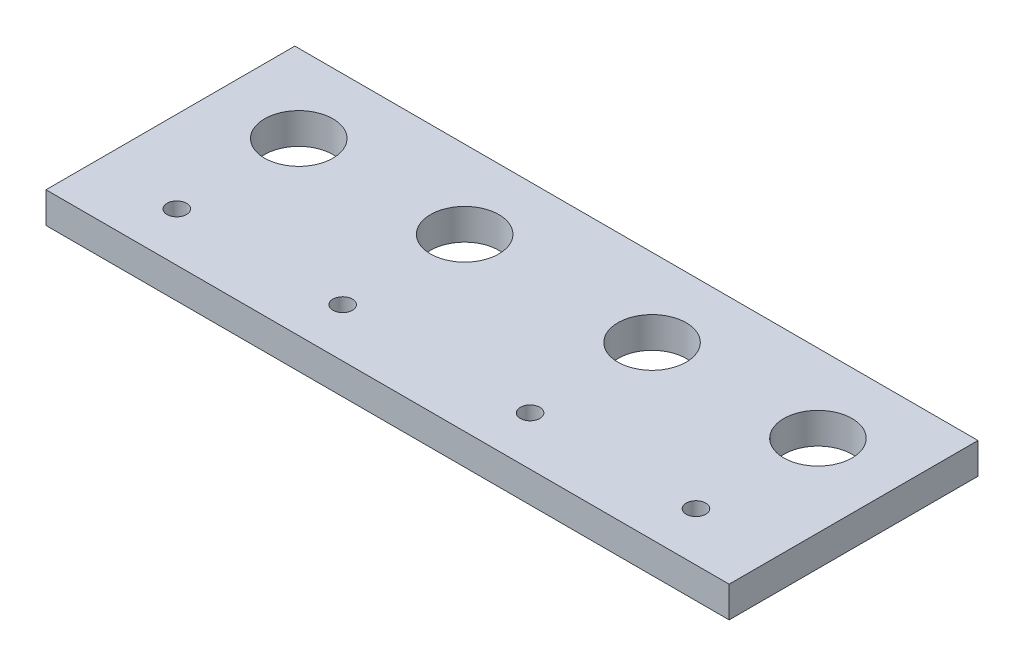
ISO-10303-21;
HEADER;
FILE_DESCRIPTION(('STEP AP214'),'2;1');
FILE_NAME('part.step','',(''),(''),'','','');
FILE_SCHEMA(('AUTOMOTIVE_DESIGN { 1 0 10303 214 1 1 1 1 }'));
ENDSEC;
DATA;
#1=APPLICATION_CONTEXT('core data for automotive mechanical design processes');
#2=APPLICATION_PROTOCOL_DEFINITION('international standard','automotive_design',2000,#1);
#3=PRODUCT_CONTEXT('',#1,'mechanical');
#4=PRODUCT('Part','Part','',(#3));
#5=PRODUCT_RELATED_PRODUCT_CATEGORY('part','',(#4));
#6=PRODUCT_DEFINITION_FORMATION('','',#4);
#7=PRODUCT_DEFINITION_CONTEXT('part definition',#1,'design');
#8=PRODUCT_DEFINITION('design','',#6,#7);
#9=PRODUCT_DEFINITION_SHAPE('','',#8);
#10=(LENGTH_UNIT() NAMED_UNIT(*) SI_UNIT(.MILLI.,.METRE.));
#11=(NAMED_UNIT(*) PLANE_ANGLE_UNIT() SI_UNIT($,.RADIAN.));
#12=(NAMED_UNIT(*) SI_UNIT($,.STERADIAN.) SOLID_ANGLE_UNIT());
#13=UNCERTAINTY_MEASURE_WITH_UNIT(LENGTH_MEASURE(1.E-05),#10,'distance_accuracy_value','');
#14=(GEOMETRIC_REPRESENTATION_CONTEXT(3) GLOBAL_UNCERTAINTY_ASSIGNED_CONTEXT((#13)) GLOBAL_UNIT_ASSIGNED_CONTEXT((#10,
#11,#12)) REPRESENTATION_CONTEXT('',''));
#15=CARTESIAN_POINT('',(0.,0.,0.));
#16=DIRECTION('',(0.,0.,1.));
#17=DIRECTION('',(1.,0.,0.));
#18=AXIS2_PLACEMENT_3D('',#15,#16,#17);
#19=CARTESIAN_POINT('',(0.,6.35,51.));
#20=DIRECTION('',(0.,0.,1.));
#21=DIRECTION('',(1.,0.,0.));
#22=AXIS2_PLACEMENT_3D('',#19,#20,#21);
#23=PLANE('',#22);
#24=DIRECTION('',(-1.,0.,0.));
#25=VECTOR('',#24,1.);
#26=CARTESIAN_POINT('',(0.,0.,51.));
#27=LINE('',#26,#25);
#28=CARTESIAN_POINT('',(70.,0.,51.));
#29=VERTEX_POINT('',#28);
#30=CARTESIAN_POINT('',(-70.,0.,51.));
#31=VERTEX_POINT('',#30);
#32=EDGE_CURVE('E124',#29,#31,#27,.T.);
#33=ORIENTED_EDGE('',*,*,#32,.F.);
#34=DIRECTION('',(0.,-1.,0.));
#35=VECTOR('',#34,1.);
#36=CARTESIAN_POINT('',(70.,6.35,51.));
#37=LINE('',#36,#35);
#38=CARTESIAN_POINT('',(70.,6.35,51.));
#39=VERTEX_POINT('',#38);
#40=EDGE_CURVE('E11',#39,#29,#37,.T.);
#41=ORIENTED_EDGE('',*,*,#40,.F.);
#42=DIRECTION('',(-1.,0.,0.));
#43=VECTOR('',#42,1.);
#44=CARTESIAN_POINT('',(0.,6.35,51.));
#45=LINE('',#44,#43);
#46=CARTESIAN_POINT('',(-70.,6.35,51.));
#47=VERTEX_POINT('',#46);
#48=EDGE_CURVE('E93',#39,#47,#45,.T.);
#49=ORIENTED_EDGE('',*,*,#48,.T.);
#50=DIRECTION('',(0.,-1.,0.));
#51=VECTOR('',#50,1.);
#52=CARTESIAN_POINT('',(-70.,6.35,51.));
#53=LINE('',#52,#51);
#54=EDGE_CURVE('E74',#47,#31,#53,.T.);
#55=ORIENTED_EDGE('',*,*,#54,.T.);
#56=EDGE_LOOP('',(#33,#41,#49,#55));
#57=FACE_BOUND('',#56,.T.);
#58=ADVANCED_FACE('F35',(#57),#23,.T.);
#59=CARTESIAN_POINT('',(70.,6.35,0.));
#60=DIRECTION('',(1.,0.,0.));
#61=DIRECTION('',(0.,0.,-1.));
#62=AXIS2_PLACEMENT_3D('',#59,#60,#61);
#63=PLANE('',#62);
#64=DIRECTION('',(0.,0.,1.));
#65=VECTOR('',#64,1.);
#66=CARTESIAN_POINT('',(70.,0.,0.));
#67=LINE('',#66,#65);
#68=CARTESIAN_POINT('',(70.,0.,0.));
#69=VERTEX_POINT('',#68);
#70=EDGE_CURVE('E85',#69,#29,#67,.T.);
#71=ORIENTED_EDGE('',*,*,#70,.F.);
#72=DIRECTION('',(0.,-1.,0.));
#73=VECTOR('',#72,1.);
#74=CARTESIAN_POINT('',(70.,6.35,0.));
#75=LINE('',#74,#73);
#76=CARTESIAN_POINT('',(70.,6.35,0.));
#77=VERTEX_POINT('',#76);
#78=EDGE_CURVE('E44',#77,#69,#75,.T.);
#79=ORIENTED_EDGE('',*,*,#78,.F.);
#80=DIRECTION('',(0.,0.,1.));
#81=VECTOR('',#80,1.);
#82=CARTESIAN_POINT('',(70.,6.35,0.));
#83=LINE('',#82,#81);
#84=EDGE_CURVE('E83',#77,#39,#83,.T.);
#85=ORIENTED_EDGE('',*,*,#84,.T.);
#86=ORIENTED_EDGE('',*,*,#40,.T.);
#87=EDGE_LOOP('',(#71,#79,#85,#86));
#88=FACE_BOUND('',#87,.T.);
#89=ADVANCED_FACE('F82',(#88),#63,.T.);
#90=CARTESIAN_POINT('',(0.,6.35,0.));
#91=DIRECTION('',(0.,0.,-1.));
#92=DIRECTION('',(-1.,0.,0.));
#93=AXIS2_PLACEMENT_3D('',#90,#91,#92);
#94=PLANE('',#93);
#95=DIRECTION('',(1.,0.,0.));
#96=VECTOR('',#95,1.);
#97=CARTESIAN_POINT('',(0.,0.,0.));
#98=LINE('',#97,#96);
#99=CARTESIAN_POINT('',(-70.,0.,0.));
#100=VERTEX_POINT('',#99);
#101=EDGE_CURVE('E128',#100,#69,#98,.T.);
#102=ORIENTED_EDGE('',*,*,#101,.F.);
#103=DIRECTION('',(0.,-1.,0.));
#104=VECTOR('',#103,1.);
#105=CARTESIAN_POINT('',(-70.,6.35,0.));
#106=LINE('',#105,#104);
#107=CARTESIAN_POINT('',(-70.,6.35,0.));
#108=VERTEX_POINT('',#107);
#109=EDGE_CURVE('E67',#108,#100,#106,.T.);
#110=ORIENTED_EDGE('',*,*,#109,.F.);
#111=DIRECTION('',(1.,0.,0.));
#112=VECTOR('',#111,1.);
#113=CARTESIAN_POINT('',(0.,6.35,0.));
#114=LINE('',#113,#112);
#115=EDGE_CURVE('E92',#108,#77,#114,.T.);
#116=ORIENTED_EDGE('',*,*,#115,.T.);
#117=ORIENTED_EDGE('',*,*,#78,.T.);
#118=EDGE_LOOP('',(#102,#110,#116,#117));
#119=FACE_BOUND('',#118,.T.);
#120=ADVANCED_FACE('F95',(#119),#94,.T.);
#121=CARTESIAN_POINT('',(-19.2,6.35,16.));
#122=DIRECTION('',(0.,-1.,0.));
#123=DIRECTION('',(0.,0.,-1.));
#124=AXIS2_PLACEMENT_3D('',#121,#122,#123);
#125=CYLINDRICAL_SURFACE('',#124,7.00000000000001);
#126=CARTESIAN_POINT('',(-19.2,6.35,16.));
#127=DIRECTION('',(0.,1.,0.));
#128=DIRECTION('',(0.,0.,1.));
#129=AXIS2_PLACEMENT_3D('',#126,#127,#128);
#130=CIRCLE('',#129,7.00000000000001);
#131=CARTESIAN_POINT('',(-19.2,6.35,23.));
#132=VERTEX_POINT('',#131);
#133=EDGE_CURVE('E115',#132,#132,#130,.F.);
#134=ORIENTED_EDGE('',*,*,#133,.F.);
#135=EDGE_LOOP('',(#134));
#136=FACE_BOUND('',#135,.T.);
#137=CARTESIAN_POINT('',(-19.2,0.,16.));
#138=DIRECTION('',(0.,1.,0.));
#139=DIRECTION('',(0.,0.,1.));
#140=AXIS2_PLACEMENT_3D('',#137,#138,#139);
#141=CIRCLE('',#140,7.00000000000001);
#142=CARTESIAN_POINT('',(-19.2,0.,23.));
#143=VERTEX_POINT('',#142);
#144=EDGE_CURVE('E147',#143,#143,#141,.F.);
#145=ORIENTED_EDGE('',*,*,#144,.T.);
#146=EDGE_LOOP('',(#145));
#147=FACE_BOUND('',#146,.T.);
#148=ADVANCED_FACE('F169',(#136,#147),#125,.F.);
#149=CARTESIAN_POINT('',(53.2,6.35,16.));
#150=DIRECTION('',(0.,-1.,0.));
#151=DIRECTION('',(0.,0.,-1.));
#152=AXIS2_PLACEMENT_3D('',#149,#150,#151);
#153=CYLINDRICAL_SURFACE('',#152,6.99999999999999);
#154=CARTESIAN_POINT('',(53.2,6.35,16.));
#155=DIRECTION('',(0.,1.,0.));
#156=DIRECTION('',(0.,0.,1.));
#157=AXIS2_PLACEMENT_3D('',#154,#155,#156);
#158=CIRCLE('',#157,6.99999999999999);
#159=CARTESIAN_POINT('',(53.2,6.35,23.));
#160=VERTEX_POINT('',#159);
#161=EDGE_CURVE('E112',#160,#160,#158,.T.);
#162=ORIENTED_EDGE('',*,*,#161,.T.);
#163=EDGE_LOOP('',(#162));
#164=FACE_BOUND('',#163,.T.);
#165=CARTESIAN_POINT('',(53.2,0.,16.));
#166=DIRECTION('',(0.,1.,0.));
#167=DIRECTION('',(0.,0.,1.));
#168=AXIS2_PLACEMENT_3D('',#165,#166,#167);
#169=CIRCLE('',#168,6.99999999999999);
#170=CARTESIAN_POINT('',(53.2,0.,23.));
#171=VERTEX_POINT('',#170);
#172=EDGE_CURVE('E144',#171,#171,#169,.T.);
#173=ORIENTED_EDGE('',*,*,#172,.F.);
#174=EDGE_LOOP('',(#173));
#175=FACE_BOUND('',#174,.T.);
#176=ADVANCED_FACE('F188',(#164,#175),#153,.F.);
#177=CARTESIAN_POINT('',(19.2,6.35,16.));
#178=DIRECTION('',(0.,-1.,0.));
#179=DIRECTION('',(0.,0.,-1.));
#180=AXIS2_PLACEMENT_3D('',#177,#178,#179);
#181=CYLINDRICAL_SURFACE('',#180,7.);
#182=CARTESIAN_POINT('',(19.2,6.35,16.));
#183=DIRECTION('',(0.,1.,0.));
#184=DIRECTION('',(0.,0.,1.));
#185=AXIS2_PLACEMENT_3D('',#182,#183,#184);
#186=CIRCLE('',#185,7.);
#187=CARTESIAN_POINT('',(19.2,6.35,23.));
#188=VERTEX_POINT('',#187);
#189=EDGE_CURVE('E109',#188,#188,#186,.T.);
#190=ORIENTED_EDGE('',*,*,#189,.T.);
#191=EDGE_LOOP('',(#190));
#192=FACE_BOUND('',#191,.T.);
#193=CARTESIAN_POINT('',(19.2,0.,16.));
#194=DIRECTION('',(0.,1.,0.));
#195=DIRECTION('',(0.,0.,1.));
#196=AXIS2_PLACEMENT_3D('',#193,#194,#195);
#197=CIRCLE('',#196,7.);
#198=CARTESIAN_POINT('',(19.2,0.,23.));
#199=VERTEX_POINT('',#198);
#200=EDGE_CURVE('E141',#199,#199,#197,.T.);
#201=ORIENTED_EDGE('',*,*,#200,.F.);
#202=EDGE_LOOP('',(#201));
#203=FACE_BOUND('',#202,.T.);
#204=ADVANCED_FACE('F184',(#192,#203),#181,.F.);
#205=CARTESIAN_POINT('',(-53.2,6.35,41.));
#206=DIRECTION('',(0.,-1.,0.));
#207=DIRECTION('',(0.,0.,-1.));
#208=AXIS2_PLACEMENT_3D('',#205,#206,#207);
#209=CYLINDRICAL_SURFACE('',#208,2.);
#210=CARTESIAN_POINT('',(-53.2,6.35,41.));
#211=DIRECTION('',(0.,1.,0.));
#212=DIRECTION('',(0.,0.,1.));
#213=AXIS2_PLACEMENT_3D('',#210,#211,#212);
#214=CIRCLE('',#213,2.);
#215=CARTESIAN_POINT('',(-53.2,6.35,43.));
#216=VERTEX_POINT('',#215);
#217=EDGE_CURVE('E106',#216,#216,#214,.T.);
#218=ORIENTED_EDGE('',*,*,#217,.T.);
#219=EDGE_LOOP('',(#218));
#220=FACE_BOUND('',#219,.T.);
#221=CARTESIAN_POINT('',(-53.2,0.,41.));
#222=DIRECTION('',(0.,1.,0.));
#223=DIRECTION('',(0.,0.,1.));
#224=AXIS2_PLACEMENT_3D('',#221,#222,#223);
#225=CIRCLE('',#224,2.);
#226=CARTESIAN_POINT('',(-53.2,0.,43.));
#227=VERTEX_POINT('',#226);
#228=EDGE_CURVE('E138',#227,#227,#225,.T.);
#229=ORIENTED_EDGE('',*,*,#228,.F.);
#230=EDGE_LOOP('',(#229));
#231=FACE_BOUND('',#230,.T.);
#232=ADVANCED_FACE('F180',(#220,#231),#209,.F.);
#233=CARTESIAN_POINT('',(19.2,6.35,41.));
#234=DIRECTION('',(0.,-1.,0.));
#235=DIRECTION('',(0.,0.,-1.));
#236=AXIS2_PLACEMENT_3D('',#233,#234,#235);
#237=CYLINDRICAL_SURFACE('',#236,2.);
#238=CARTESIAN_POINT('',(19.2,6.35,41.));
#239=DIRECTION('',(0.,1.,0.));
#240=DIRECTION('',(0.,0.,1.));
#241=AXIS2_PLACEMENT_3D('',#238,#239,#240);
#242=CIRCLE('',#241,2.);
#243=CARTESIAN_POINT('',(19.2,6.35,43.));
#244=VERTEX_POINT('',#243);
#245=EDGE_CURVE('E103',#244,#244,#242,.F.);
#246=ORIENTED_EDGE('',*,*,#245,.F.);
#247=EDGE_LOOP('',(#246));
#248=FACE_BOUND('',#247,.T.);
#249=CARTESIAN_POINT('',(19.2,0.,41.));
#250=DIRECTION('',(0.,1.,0.));
#251=DIRECTION('',(0.,0.,1.));
#252=AXIS2_PLACEMENT_3D('',#249,#250,#251);
#253=CIRCLE('',#252,2.);
#254=CARTESIAN_POINT('',(19.2,0.,43.));
#255=VERTEX_POINT('',#254);
#256=EDGE_CURVE('E135',#255,#255,#253,.F.);
#257=ORIENTED_EDGE('',*,*,#256,.T.);
#258=EDGE_LOOP('',(#257));
#259=FACE_BOUND('',#258,.T.);
#260=ADVANCED_FACE('F176',(#248,#259),#237,.F.);
#261=CARTESIAN_POINT('',(-19.2,6.35,41.));
#262=DIRECTION('',(0.,-1.,0.));
#263=DIRECTION('',(0.,0.,-1.));
#264=AXIS2_PLACEMENT_3D('',#261,#262,#263);
#265=CYLINDRICAL_SURFACE('',#264,2.);
#266=CARTESIAN_POINT('',(-19.2,6.35,41.));
#267=DIRECTION('',(0.,1.,0.));
#268=DIRECTION('',(0.,0.,1.));
#269=AXIS2_PLACEMENT_3D('',#266,#267,#268);
#270=CIRCLE('',#269,2.);
#271=CARTESIAN_POINT('',(-19.2,6.35,43.));
#272=VERTEX_POINT('',#271);
#273=EDGE_CURVE('E97',#272,#272,#270,.T.);
#274=ORIENTED_EDGE('',*,*,#273,.T.);
#275=EDGE_LOOP('',(#274));
#276=FACE_BOUND('',#275,.T.);
#277=CARTESIAN_POINT('',(-19.2,0.,41.));
#278=DIRECTION('',(0.,1.,0.));
#279=DIRECTION('',(0.,0.,1.));
#280=AXIS2_PLACEMENT_3D('',#277,#278,#279);
#281=CIRCLE('',#280,2.);
#282=CARTESIAN_POINT('',(-19.2,0.,43.));
#283=VERTEX_POINT('',#282);
#284=EDGE_CURVE('E132',#283,#283,#281,.T.);
#285=ORIENTED_EDGE('',*,*,#284,.F.);
#286=EDGE_LOOP('',(#285));
#287=FACE_BOUND('',#286,.T.);
#288=ADVANCED_FACE('F173',(#276,#287),#265,.F.);
#289=CARTESIAN_POINT('',(-70.,6.35,0.));
#290=DIRECTION('',(1.,0.,0.));
#291=DIRECTION('',(0.,0.,-1.));
#292=AXIS2_PLACEMENT_3D('',#289,#290,#291);
#293=PLANE('',#292);
#294=DIRECTION('',(0.,0.,1.));
#295=VECTOR('',#294,1.);
#296=CARTESIAN_POINT('',(-70.,0.,0.));
#297=LINE('',#296,#295);
#298=EDGE_CURVE('E130',#100,#31,#297,.T.);
#299=ORIENTED_EDGE('',*,*,#298,.T.);
#300=ORIENTED_EDGE('',*,*,#54,.F.);
#301=DIRECTION('',(0.,0.,1.));
#302=VECTOR('',#301,1.);
#303=CARTESIAN_POINT('',(-70.,6.35,0.));
#304=LINE('',#303,#302);
#305=EDGE_CURVE('E52',#108,#47,#304,.T.);
#306=ORIENTED_EDGE('',*,*,#305,.F.);
#307=ORIENTED_EDGE('',*,*,#109,.T.);
#308=EDGE_LOOP('',(#299,#300,#306,#307));
#309=FACE_BOUND('',#308,.T.);
#310=ADVANCED_FACE('F170',(#309),#293,.F.);
#311=CARTESIAN_POINT('',(53.2,6.35,41.));
#312=DIRECTION('',(0.,-1.,0.));
#313=DIRECTION('',(0.,0.,-1.));
#314=AXIS2_PLACEMENT_3D('',#311,#312,#313);
#315=CYLINDRICAL_SURFACE('',#314,1.99999999999999);
#316=CARTESIAN_POINT('',(53.2,6.35,41.));
#317=DIRECTION('',(0.,1.,0.));
#318=DIRECTION('',(0.,0.,1.));
#319=AXIS2_PLACEMENT_3D('',#316,#317,#318);
#320=CIRCLE('',#319,1.99999999999999);
#321=CARTESIAN_POINT('',(53.2,6.35,43.));
#322=VERTEX_POINT('',#321);
#323=EDGE_CURVE('E153',#322,#322,#320,.F.);
#324=ORIENTED_EDGE('',*,*,#323,.F.);
#325=EDGE_LOOP('',(#324));
#326=FACE_BOUND('',#325,.T.);
#327=CARTESIAN_POINT('',(53.2,0.,41.));
#328=DIRECTION('',(0.,1.,0.));
#329=DIRECTION('',(0.,0.,1.));
#330=AXIS2_PLACEMENT_3D('',#327,#328,#329);
#331=CIRCLE('',#330,1.99999999999999);
#332=CARTESIAN_POINT('',(53.2,0.,43.));
#333=VERTEX_POINT('',#332);
#334=EDGE_CURVE('E121',#333,#333,#331,.F.);
#335=ORIENTED_EDGE('',*,*,#334,.T.);
#336=EDGE_LOOP('',(#335));
#337=FACE_BOUND('',#336,.T.);
#338=ADVANCED_FACE('F37',(#326,#337),#315,.F.);
#339=CARTESIAN_POINT('',(-53.2,6.35,16.));
#340=DIRECTION('',(0.,-1.,0.));
#341=DIRECTION('',(0.,0.,-1.));
#342=AXIS2_PLACEMENT_3D('',#339,#340,#341);
#343=CYLINDRICAL_SURFACE('',#342,6.99999999999999);
#344=CARTESIAN_POINT('',(-53.2,6.35,16.));
#345=DIRECTION('',(0.,1.,0.));
#346=DIRECTION('',(0.,0.,1.));
#347=AXIS2_PLACEMENT_3D('',#344,#345,#346);
#348=CIRCLE('',#347,6.99999999999999);
#349=CARTESIAN_POINT('',(-53.2,6.35,23.));
#350=VERTEX_POINT('',#349);
#351=EDGE_CURVE('E118',#350,#350,#348,.F.);
#352=ORIENTED_EDGE('',*,*,#351,.F.);
#353=EDGE_LOOP('',(#352));
#354=FACE_BOUND('',#353,.T.);
#355=CARTESIAN_POINT('',(-53.2,0.,16.));
#356=DIRECTION('',(0.,1.,0.));
#357=DIRECTION('',(0.,0.,1.));
#358=AXIS2_PLACEMENT_3D('',#355,#356,#357);
#359=CIRCLE('',#358,6.99999999999999);
#360=CARTESIAN_POINT('',(-53.2,0.,23.));
#361=VERTEX_POINT('',#360);
#362=EDGE_CURVE('E150',#361,#361,#359,.F.);
#363=ORIENTED_EDGE('',*,*,#362,.T.);
#364=EDGE_LOOP('',(#363));
#365=FACE_BOUND('',#364,.T.);
#366=ADVANCED_FACE('F196',(#354,#365),#343,.F.);
#367=CARTESIAN_POINT('',(0.,6.35,0.));
#368=DIRECTION('',(0.,1.,0.));
#369=DIRECTION('',(0.,0.,1.));
#370=AXIS2_PLACEMENT_3D('',#367,#368,#369);
#371=PLANE('',#370);
#372=ORIENTED_EDGE('',*,*,#323,.T.);
#373=EDGE_LOOP('',(#372));
#374=FACE_BOUND('',#373,.T.);
#375=ORIENTED_EDGE('',*,*,#48,.F.);
#376=ORIENTED_EDGE('',*,*,#84,.F.);
#377=ORIENTED_EDGE('',*,*,#115,.F.);
#378=ORIENTED_EDGE('',*,*,#305,.T.);
#379=EDGE_LOOP('',(#375,#376,#377,#378));
#380=FACE_BOUND('',#379,.T.);
#381=ORIENTED_EDGE('',*,*,#273,.F.);
#382=EDGE_LOOP('',(#381));
#383=FACE_BOUND('',#382,.T.);
#384=ORIENTED_EDGE('',*,*,#245,.T.);
#385=EDGE_LOOP('',(#384));
#386=FACE_BOUND('',#385,.T.);
#387=ORIENTED_EDGE('',*,*,#217,.F.);
#388=EDGE_LOOP('',(#387));
#389=FACE_BOUND('',#388,.T.);
#390=ORIENTED_EDGE('',*,*,#189,.F.);
#391=EDGE_LOOP('',(#390));
#392=FACE_BOUND('',#391,.T.);
#393=ORIENTED_EDGE('',*,*,#161,.F.);
#394=EDGE_LOOP('',(#393));
#395=FACE_BOUND('',#394,.T.);
#396=ORIENTED_EDGE('',*,*,#133,.T.);
#397=EDGE_LOOP('',(#396));
#398=FACE_BOUND('',#397,.T.);
#399=ORIENTED_EDGE('',*,*,#351,.T.);
#400=EDGE_LOOP('',(#399));
#401=FACE_BOUND('',#400,.T.);
#402=ADVANCED_FACE('F90',(#374,#380,#383,#386,#389,#392,#395,#398,#401),#371,.T.);
#403=CARTESIAN_POINT('',(0.,0.,0.));
#404=DIRECTION('',(0.,1.,0.));
#405=DIRECTION('',(0.,0.,1.));
#406=AXIS2_PLACEMENT_3D('',#403,#404,#405);
#407=PLANE('',#406);
#408=ORIENTED_EDGE('',*,*,#334,.F.);
#409=EDGE_LOOP('',(#408));
#410=FACE_BOUND('',#409,.T.);
#411=ORIENTED_EDGE('',*,*,#32,.T.);
#412=ORIENTED_EDGE('',*,*,#298,.F.);
#413=ORIENTED_EDGE('',*,*,#101,.T.);
#414=ORIENTED_EDGE('',*,*,#70,.T.);
#415=EDGE_LOOP('',(#411,#412,#413,#414));
#416=FACE_BOUND('',#415,.T.);
#417=ORIENTED_EDGE('',*,*,#284,.T.);
#418=EDGE_LOOP('',(#417));
#419=FACE_BOUND('',#418,.T.);
#420=ORIENTED_EDGE('',*,*,#256,.F.);
#421=EDGE_LOOP('',(#420));
#422=FACE_BOUND('',#421,.T.);
#423=ORIENTED_EDGE('',*,*,#228,.T.);
#424=EDGE_LOOP('',(#423));
#425=FACE_BOUND('',#424,.T.);
#426=ORIENTED_EDGE('',*,*,#200,.T.);
#427=EDGE_LOOP('',(#426));
#428=FACE_BOUND('',#427,.T.);
#429=ORIENTED_EDGE('',*,*,#172,.T.);
#430=EDGE_LOOP('',(#429));
#431=FACE_BOUND('',#430,.T.);
#432=ORIENTED_EDGE('',*,*,#144,.F.);
#433=EDGE_LOOP('',(#432));
#434=FACE_BOUND('',#433,.T.);
#435=ORIENTED_EDGE('',*,*,#362,.F.);
#436=EDGE_LOOP('',(#435));
#437=FACE_BOUND('',#436,.T.);
#438=ADVANCED_FACE('F200',(#410,#416,#419,#422,#425,#428,#431,#434,#437),#407,.F.);
#439=CLOSED_SHELL('',(#58,#89,#120,#148,#176,#204,#232,#260,#288,#310,#338,#366,#402,#438));
#440=MANIFOLD_SOLID_BREP('B2',#439);
#441=ADVANCED_BREP_SHAPE_REPRESENTATION('',(#18,#440),#14);
#442=SHAPE_DEFINITION_REPRESENTATION(#9,#441);
ENDSEC;
END-ISO-10303-21;
